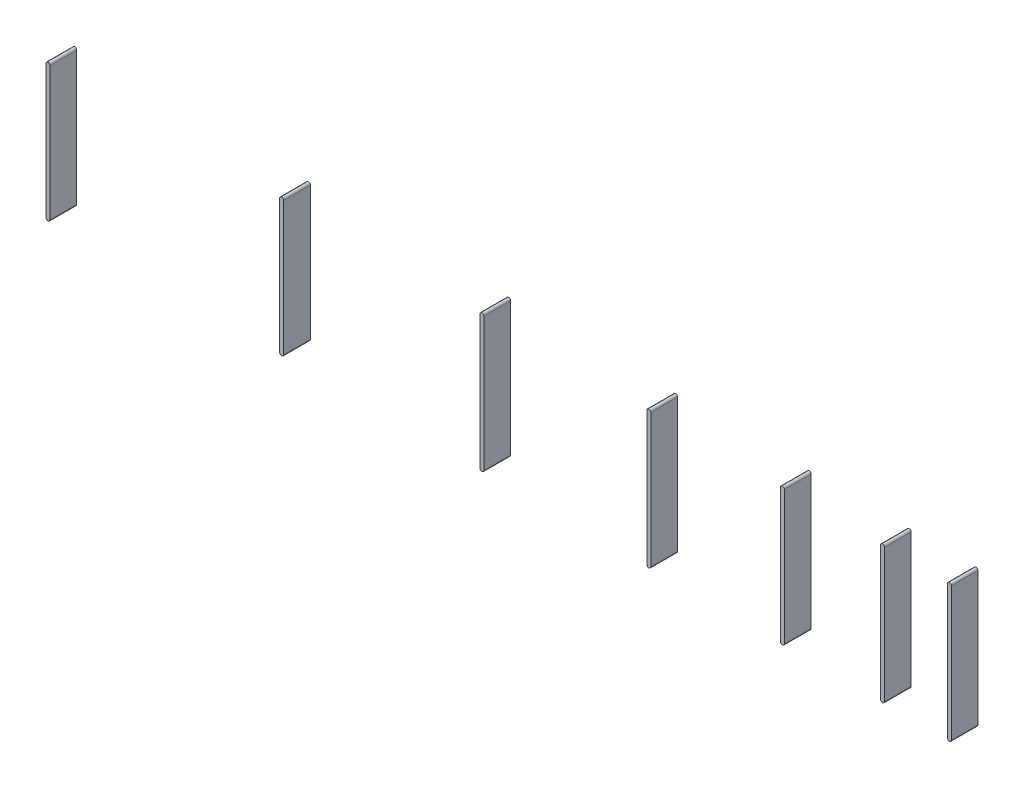
ISO-10303-21;
HEADER;
FILE_DESCRIPTION(('STEP AP214'),'2;1');
FILE_NAME('part.step','',(''),(''),'','','');
FILE_SCHEMA(('AUTOMOTIVE_DESIGN { 1 0 10303 214 1 1 1 1 }'));
ENDSEC;
DATA;
#1=APPLICATION_CONTEXT('core data for automotive mechanical design processes');
#2=APPLICATION_PROTOCOL_DEFINITION('international standard','automotive_design',2000,#1);
#3=PRODUCT_CONTEXT('',#1,'mechanical');
#4=PRODUCT('Part','Part','',(#3));
#5=PRODUCT_RELATED_PRODUCT_CATEGORY('part','',(#4));
#6=PRODUCT_DEFINITION_FORMATION('','',#4);
#7=PRODUCT_DEFINITION_CONTEXT('part definition',#1,'design');
#8=PRODUCT_DEFINITION('design','',#6,#7);
#9=PRODUCT_DEFINITION_SHAPE('','',#8);
#10=(LENGTH_UNIT() NAMED_UNIT(*) SI_UNIT(.MILLI.,.METRE.));
#11=(NAMED_UNIT(*) PLANE_ANGLE_UNIT() SI_UNIT($,.RADIAN.));
#12=(NAMED_UNIT(*) SI_UNIT($,.STERADIAN.) SOLID_ANGLE_UNIT());
#13=UNCERTAINTY_MEASURE_WITH_UNIT(LENGTH_MEASURE(1.E-05),#10,'distance_accuracy_value','');
#14=(GEOMETRIC_REPRESENTATION_CONTEXT(3) GLOBAL_UNCERTAINTY_ASSIGNED_CONTEXT((#13)) GLOBAL_UNIT_ASSIGNED_CONTEXT((#10,
#11,#12)) REPRESENTATION_CONTEXT('',''));
#15=CARTESIAN_POINT('',(0.,0.,0.));
#16=DIRECTION('',(0.,0.,1.));
#17=DIRECTION('',(1.,0.,0.));
#18=AXIS2_PLACEMENT_3D('',#15,#16,#17);
#19=CARTESIAN_POINT('',(-110.,0.,4.));
#20=DIRECTION('',(0.,0.,-1.));
#21=DIRECTION('',(-1.,0.,0.));
#22=AXIS2_PLACEMENT_3D('',#19,#20,#21);
#23=CYLINDRICAL_SURFACE('',#22,0.300000000000009);
#24=CARTESIAN_POINT('',(-110.,0.,0.));
#25=DIRECTION('',(0.,0.,1.));
#26=DIRECTION('',(1.,0.,0.));
#27=AXIS2_PLACEMENT_3D('',#24,#25,#26);
#28=CIRCLE('',#27,0.300000000000009);
#29=CARTESIAN_POINT('',(-109.7,0.,0.));
#30=VERTEX_POINT('',#29);
#31=CARTESIAN_POINT('',(-110.3,0.,0.));
#32=VERTEX_POINT('',#31);
#33=EDGE_CURVE('E107',#30,#32,#28,.T.);
#34=ORIENTED_EDGE('',*,*,#33,.T.);
#35=DIRECTION('',(0.,0.,-1.));
#36=VECTOR('',#35,1.);
#37=CARTESIAN_POINT('',(-110.3,0.,4.));
#38=LINE('',#37,#36);
#39=CARTESIAN_POINT('',(-110.3,0.,4.));
#40=VERTEX_POINT('',#39);
#41=EDGE_CURVE('E12',#40,#32,#38,.T.);
#42=ORIENTED_EDGE('',*,*,#41,.F.);
#43=CARTESIAN_POINT('',(-110.,0.,4.));
#44=DIRECTION('',(0.,0.,1.));
#45=DIRECTION('',(1.,0.,0.));
#46=AXIS2_PLACEMENT_3D('',#43,#44,#45);
#47=CIRCLE('',#46,0.300000000000009);
#48=CARTESIAN_POINT('',(-109.7,0.,4.));
#49=VERTEX_POINT('',#48);
#50=EDGE_CURVE('E95',#49,#40,#47,.T.);
#51=ORIENTED_EDGE('',*,*,#50,.F.);
#52=DIRECTION('',(0.,0.,-1.));
#53=VECTOR('',#52,1.);
#54=CARTESIAN_POINT('',(-109.7,0.,4.));
#55=LINE('',#54,#53);
#56=EDGE_CURVE('E103',#49,#30,#55,.T.);
#57=ORIENTED_EDGE('',*,*,#56,.T.);
#58=EDGE_LOOP('',(#34,#42,#51,#57));
#59=FACE_BOUND('',#58,.T.);
#60=ADVANCED_FACE('F44',(#59),#23,.T.);
#61=CARTESIAN_POINT('',(-110.3,0.,4.));
#62=DIRECTION('',(1.,0.,0.));
#63=DIRECTION('',(0.,0.,-1.));
#64=AXIS2_PLACEMENT_3D('',#61,#62,#63);
#65=PLANE('',#64);
#66=DIRECTION('',(0.,-1.,0.));
#67=VECTOR('',#66,1.);
#68=CARTESIAN_POINT('',(-110.3,0.,0.));
#69=LINE('',#68,#67);
#70=CARTESIAN_POINT('',(-110.3,-20.,0.));
#71=VERTEX_POINT('',#70);
#72=EDGE_CURVE('E99',#32,#71,#69,.T.);
#73=ORIENTED_EDGE('',*,*,#72,.T.);
#74=DIRECTION('',(0.,0.,-1.));
#75=VECTOR('',#74,1.);
#76=CARTESIAN_POINT('',(-110.3,-20.,4.));
#77=LINE('',#76,#75);
#78=CARTESIAN_POINT('',(-110.3,-20.,4.));
#79=VERTEX_POINT('',#78);
#80=EDGE_CURVE('E52',#79,#71,#77,.T.);
#81=ORIENTED_EDGE('',*,*,#80,.F.);
#82=DIRECTION('',(0.,-1.,0.));
#83=VECTOR('',#82,1.);
#84=CARTESIAN_POINT('',(-110.3,0.,4.));
#85=LINE('',#84,#83);
#86=EDGE_CURVE('E90',#40,#79,#85,.T.);
#87=ORIENTED_EDGE('',*,*,#86,.F.);
#88=ORIENTED_EDGE('',*,*,#41,.T.);
#89=EDGE_LOOP('',(#73,#81,#87,#88));
#90=FACE_BOUND('',#89,.T.);
#91=ADVANCED_FACE('F98',(#90),#65,.F.);
#92=CARTESIAN_POINT('',(-110.,-20.,4.));
#93=DIRECTION('',(0.,0.,-1.));
#94=DIRECTION('',(-1.,0.,0.));
#95=AXIS2_PLACEMENT_3D('',#92,#93,#94);
#96=CYLINDRICAL_SURFACE('',#95,0.300000000000009);
#97=CARTESIAN_POINT('',(-110.,-20.,0.));
#98=DIRECTION('',(0.,0.,1.));
#99=DIRECTION('',(1.,0.,0.));
#100=AXIS2_PLACEMENT_3D('',#97,#98,#99);
#101=CIRCLE('',#100,0.300000000000009);
#102=CARTESIAN_POINT('',(-109.7,-20.,0.));
#103=VERTEX_POINT('',#102);
#104=EDGE_CURVE('E77',#71,#103,#101,.T.);
#105=ORIENTED_EDGE('',*,*,#104,.T.);
#106=DIRECTION('',(0.,0.,-1.));
#107=VECTOR('',#106,1.);
#108=CARTESIAN_POINT('',(-109.7,-20.,4.));
#109=LINE('',#108,#107);
#110=CARTESIAN_POINT('',(-109.7,-20.,4.));
#111=VERTEX_POINT('',#110);
#112=EDGE_CURVE('E100',#111,#103,#109,.T.);
#113=ORIENTED_EDGE('',*,*,#112,.F.);
#114=CARTESIAN_POINT('',(-110.,-20.,4.));
#115=DIRECTION('',(0.,0.,1.));
#116=DIRECTION('',(1.,0.,0.));
#117=AXIS2_PLACEMENT_3D('',#114,#115,#116);
#118=CIRCLE('',#117,0.300000000000009);
#119=EDGE_CURVE('E93',#79,#111,#118,.T.);
#120=ORIENTED_EDGE('',*,*,#119,.F.);
#121=ORIENTED_EDGE('',*,*,#80,.T.);
#122=EDGE_LOOP('',(#105,#113,#120,#121));
#123=FACE_BOUND('',#122,.T.);
#124=ADVANCED_FACE('F101',(#123),#96,.T.);
#125=CARTESIAN_POINT('',(-109.7,0.,4.));
#126=DIRECTION('',(-1.,0.,0.));
#127=DIRECTION('',(0.,0.,1.));
#128=AXIS2_PLACEMENT_3D('',#125,#126,#127);
#129=PLANE('',#128);
#130=DIRECTION('',(0.,1.,0.));
#131=VECTOR('',#130,1.);
#132=CARTESIAN_POINT('',(-109.7,0.,0.));
#133=LINE('',#132,#131);
#134=EDGE_CURVE('E83',#103,#30,#133,.T.);
#135=ORIENTED_EDGE('',*,*,#134,.T.);
#136=ORIENTED_EDGE('',*,*,#56,.F.);
#137=DIRECTION('',(0.,1.,0.));
#138=VECTOR('',#137,1.);
#139=CARTESIAN_POINT('',(-109.7,0.,4.));
#140=LINE('',#139,#138);
#141=EDGE_CURVE('E60',#111,#49,#140,.T.);
#142=ORIENTED_EDGE('',*,*,#141,.F.);
#143=ORIENTED_EDGE('',*,*,#112,.T.);
#144=EDGE_LOOP('',(#135,#136,#142,#143));
#145=FACE_BOUND('',#144,.T.);
#146=ADVANCED_FACE('F114',(#145),#129,.F.);
#147=CARTESIAN_POINT('',(-110.,0.,4.));
#148=DIRECTION('',(0.,0.,1.));
#149=DIRECTION('',(1.,0.,0.));
#150=AXIS2_PLACEMENT_3D('',#147,#148,#149);
#151=PLANE('',#150);
#152=ORIENTED_EDGE('',*,*,#50,.T.);
#153=ORIENTED_EDGE('',*,*,#86,.T.);
#154=ORIENTED_EDGE('',*,*,#119,.T.);
#155=ORIENTED_EDGE('',*,*,#141,.T.);
#156=EDGE_LOOP('',(#152,#153,#154,#155));
#157=FACE_BOUND('',#156,.T.);
#158=ADVANCED_FACE('F91',(#157),#151,.T.);
#159=CARTESIAN_POINT('',(-110.,0.,0.));
#160=DIRECTION('',(0.,0.,1.));
#161=DIRECTION('',(1.,0.,0.));
#162=AXIS2_PLACEMENT_3D('',#159,#160,#161);
#163=PLANE('',#162);
#164=ORIENTED_EDGE('',*,*,#33,.F.);
#165=ORIENTED_EDGE('',*,*,#134,.F.);
#166=ORIENTED_EDGE('',*,*,#104,.F.);
#167=ORIENTED_EDGE('',*,*,#72,.F.);
#168=EDGE_LOOP('',(#164,#165,#166,#167));
#169=FACE_BOUND('',#168,.T.);
#170=ADVANCED_FACE('F117',(#169),#163,.F.);
#171=CLOSED_SHELL('',(#60,#91,#124,#146,#158,#170));
#172=MANIFOLD_SOLID_BREP('B2',#171);
#173=CARTESIAN_POINT('',(-75.,0.,4.));
#174=DIRECTION('',(0.,0.,-1.));
#175=DIRECTION('',(-1.,0.,0.));
#176=AXIS2_PLACEMENT_3D('',#173,#174,#175);
#177=CYLINDRICAL_SURFACE('',#176,0.300000000000009);
#178=CARTESIAN_POINT('',(-75.,0.,0.));
#179=DIRECTION('',(0.,0.,1.));
#180=DIRECTION('',(1.,0.,0.));
#181=AXIS2_PLACEMENT_3D('',#178,#179,#180);
#182=CIRCLE('',#181,0.300000000000009);
#183=CARTESIAN_POINT('',(-74.7,0.,0.));
#184=VERTEX_POINT('',#183);
#185=CARTESIAN_POINT('',(-75.3,0.,0.));
#186=VERTEX_POINT('',#185);
#187=EDGE_CURVE('E241',#184,#186,#182,.T.);
#188=ORIENTED_EDGE('',*,*,#187,.T.);
#189=DIRECTION('',(0.,0.,-1.));
#190=VECTOR('',#189,1.);
#191=CARTESIAN_POINT('',(-75.3,0.,4.));
#192=LINE('',#191,#190);
#193=CARTESIAN_POINT('',(-75.3,0.,4.));
#194=VERTEX_POINT('',#193);
#195=EDGE_CURVE('E42',#194,#186,#192,.T.);
#196=ORIENTED_EDGE('',*,*,#195,.F.);
#197=CARTESIAN_POINT('',(-75.,0.,4.));
#198=DIRECTION('',(0.,0.,1.));
#199=DIRECTION('',(1.,0.,0.));
#200=AXIS2_PLACEMENT_3D('',#197,#198,#199);
#201=CIRCLE('',#200,0.300000000000009);
#202=CARTESIAN_POINT('',(-74.7,0.,4.));
#203=VERTEX_POINT('',#202);
#204=EDGE_CURVE('E229',#203,#194,#201,.T.);
#205=ORIENTED_EDGE('',*,*,#204,.F.);
#206=DIRECTION('',(0.,0.,-1.));
#207=VECTOR('',#206,1.);
#208=CARTESIAN_POINT('',(-74.7,0.,4.));
#209=LINE('',#208,#207);
#210=EDGE_CURVE('E237',#203,#184,#209,.T.);
#211=ORIENTED_EDGE('',*,*,#210,.T.);
#212=EDGE_LOOP('',(#188,#196,#205,#211));
#213=FACE_BOUND('',#212,.T.);
#214=ADVANCED_FACE('F178',(#213),#177,.T.);
#215=CARTESIAN_POINT('',(-75.3,0.,4.));
#216=DIRECTION('',(1.,0.,0.));
#217=DIRECTION('',(0.,0.,-1.));
#218=AXIS2_PLACEMENT_3D('',#215,#216,#217);
#219=PLANE('',#218);
#220=DIRECTION('',(0.,-1.,0.));
#221=VECTOR('',#220,1.);
#222=CARTESIAN_POINT('',(-75.3,0.,0.));
#223=LINE('',#222,#221);
#224=CARTESIAN_POINT('',(-75.3,-20.,0.));
#225=VERTEX_POINT('',#224);
#226=EDGE_CURVE('E233',#186,#225,#223,.T.);
#227=ORIENTED_EDGE('',*,*,#226,.T.);
#228=DIRECTION('',(0.,0.,-1.));
#229=VECTOR('',#228,1.);
#230=CARTESIAN_POINT('',(-75.3,-20.,4.));
#231=LINE('',#230,#229);
#232=CARTESIAN_POINT('',(-75.3,-20.,4.));
#233=VERTEX_POINT('',#232);
#234=EDGE_CURVE('E186',#233,#225,#231,.T.);
#235=ORIENTED_EDGE('',*,*,#234,.F.);
#236=DIRECTION('',(0.,-1.,0.));
#237=VECTOR('',#236,1.);
#238=CARTESIAN_POINT('',(-75.3,0.,4.));
#239=LINE('',#238,#237);
#240=EDGE_CURVE('E224',#194,#233,#239,.T.);
#241=ORIENTED_EDGE('',*,*,#240,.F.);
#242=ORIENTED_EDGE('',*,*,#195,.T.);
#243=EDGE_LOOP('',(#227,#235,#241,#242));
#244=FACE_BOUND('',#243,.T.);
#245=ADVANCED_FACE('F232',(#244),#219,.F.);
#246=CARTESIAN_POINT('',(-75.,-20.,4.));
#247=DIRECTION('',(0.,0.,-1.));
#248=DIRECTION('',(-1.,0.,0.));
#249=AXIS2_PLACEMENT_3D('',#246,#247,#248);
#250=CYLINDRICAL_SURFACE('',#249,0.300000000000009);
#251=CARTESIAN_POINT('',(-75.,-20.,0.));
#252=DIRECTION('',(0.,0.,1.));
#253=DIRECTION('',(1.,0.,0.));
#254=AXIS2_PLACEMENT_3D('',#251,#252,#253);
#255=CIRCLE('',#254,0.300000000000009);
#256=CARTESIAN_POINT('',(-74.7,-20.,0.));
#257=VERTEX_POINT('',#256);
#258=EDGE_CURVE('E211',#225,#257,#255,.T.);
#259=ORIENTED_EDGE('',*,*,#258,.T.);
#260=DIRECTION('',(0.,0.,-1.));
#261=VECTOR('',#260,1.);
#262=CARTESIAN_POINT('',(-74.7,-20.,4.));
#263=LINE('',#262,#261);
#264=CARTESIAN_POINT('',(-74.7,-20.,4.));
#265=VERTEX_POINT('',#264);
#266=EDGE_CURVE('E234',#265,#257,#263,.T.);
#267=ORIENTED_EDGE('',*,*,#266,.F.);
#268=CARTESIAN_POINT('',(-75.,-20.,4.));
#269=DIRECTION('',(0.,0.,1.));
#270=DIRECTION('',(1.,0.,0.));
#271=AXIS2_PLACEMENT_3D('',#268,#269,#270);
#272=CIRCLE('',#271,0.300000000000009);
#273=EDGE_CURVE('E227',#233,#265,#272,.T.);
#274=ORIENTED_EDGE('',*,*,#273,.F.);
#275=ORIENTED_EDGE('',*,*,#234,.T.);
#276=EDGE_LOOP('',(#259,#267,#274,#275));
#277=FACE_BOUND('',#276,.T.);
#278=ADVANCED_FACE('F235',(#277),#250,.T.);
#279=CARTESIAN_POINT('',(-74.7,0.,4.));
#280=DIRECTION('',(-1.,0.,0.));
#281=DIRECTION('',(0.,0.,1.));
#282=AXIS2_PLACEMENT_3D('',#279,#280,#281);
#283=PLANE('',#282);
#284=DIRECTION('',(0.,1.,0.));
#285=VECTOR('',#284,1.);
#286=CARTESIAN_POINT('',(-74.7,0.,0.));
#287=LINE('',#286,#285);
#288=EDGE_CURVE('E217',#257,#184,#287,.T.);
#289=ORIENTED_EDGE('',*,*,#288,.T.);
#290=ORIENTED_EDGE('',*,*,#210,.F.);
#291=DIRECTION('',(0.,1.,0.));
#292=VECTOR('',#291,1.);
#293=CARTESIAN_POINT('',(-74.7,0.,4.));
#294=LINE('',#293,#292);
#295=EDGE_CURVE('E194',#265,#203,#294,.T.);
#296=ORIENTED_EDGE('',*,*,#295,.F.);
#297=ORIENTED_EDGE('',*,*,#266,.T.);
#298=EDGE_LOOP('',(#289,#290,#296,#297));
#299=FACE_BOUND('',#298,.T.);
#300=ADVANCED_FACE('F248',(#299),#283,.F.);
#301=CARTESIAN_POINT('',(-75.,0.,4.));
#302=DIRECTION('',(0.,0.,1.));
#303=DIRECTION('',(1.,0.,0.));
#304=AXIS2_PLACEMENT_3D('',#301,#302,#303);
#305=PLANE('',#304);
#306=ORIENTED_EDGE('',*,*,#204,.T.);
#307=ORIENTED_EDGE('',*,*,#240,.T.);
#308=ORIENTED_EDGE('',*,*,#273,.T.);
#309=ORIENTED_EDGE('',*,*,#295,.T.);
#310=EDGE_LOOP('',(#306,#307,#308,#309));
#311=FACE_BOUND('',#310,.T.);
#312=ADVANCED_FACE('F225',(#311),#305,.T.);
#313=CARTESIAN_POINT('',(-75.,0.,0.));
#314=DIRECTION('',(0.,0.,1.));
#315=DIRECTION('',(1.,0.,0.));
#316=AXIS2_PLACEMENT_3D('',#313,#314,#315);
#317=PLANE('',#316);
#318=ORIENTED_EDGE('',*,*,#187,.F.);
#319=ORIENTED_EDGE('',*,*,#288,.F.);
#320=ORIENTED_EDGE('',*,*,#258,.F.);
#321=ORIENTED_EDGE('',*,*,#226,.F.);
#322=EDGE_LOOP('',(#318,#319,#320,#321));
#323=FACE_BOUND('',#322,.T.);
#324=ADVANCED_FACE('F251',(#323),#317,.F.);
#325=CLOSED_SHELL('',(#214,#245,#278,#300,#312,#324));
#326=MANIFOLD_SOLID_BREP('B6',#325);
#327=CARTESIAN_POINT('',(-45.,0.,4.));
#328=DIRECTION('',(0.,0.,-1.));
#329=DIRECTION('',(-1.,0.,0.));
#330=AXIS2_PLACEMENT_3D('',#327,#328,#329);
#331=CYLINDRICAL_SURFACE('',#330,0.300000000000009);
#332=CARTESIAN_POINT('',(-45.,0.,0.));
#333=DIRECTION('',(0.,0.,1.));
#334=DIRECTION('',(1.,0.,0.));
#335=AXIS2_PLACEMENT_3D('',#332,#333,#334);
#336=CIRCLE('',#335,0.300000000000009);
#337=CARTESIAN_POINT('',(-44.7,0.,0.));
#338=VERTEX_POINT('',#337);
#339=CARTESIAN_POINT('',(-45.3,0.,0.));
#340=VERTEX_POINT('',#339);
#341=EDGE_CURVE('E375',#338,#340,#336,.T.);
#342=ORIENTED_EDGE('',*,*,#341,.T.);
#343=DIRECTION('',(0.,0.,-1.));
#344=VECTOR('',#343,1.);
#345=CARTESIAN_POINT('',(-45.3,0.,4.));
#346=LINE('',#345,#344);
#347=CARTESIAN_POINT('',(-45.3,0.,4.));
#348=VERTEX_POINT('',#347);
#349=EDGE_CURVE('E176',#348,#340,#346,.T.);
#350=ORIENTED_EDGE('',*,*,#349,.F.);
#351=CARTESIAN_POINT('',(-45.,0.,4.));
#352=DIRECTION('',(0.,0.,1.));
#353=DIRECTION('',(1.,0.,0.));
#354=AXIS2_PLACEMENT_3D('',#351,#352,#353);
#355=CIRCLE('',#354,0.300000000000009);
#356=CARTESIAN_POINT('',(-44.7,0.,4.));
#357=VERTEX_POINT('',#356);
#358=EDGE_CURVE('E363',#357,#348,#355,.T.);
#359=ORIENTED_EDGE('',*,*,#358,.F.);
#360=DIRECTION('',(0.,0.,-1.));
#361=VECTOR('',#360,1.);
#362=CARTESIAN_POINT('',(-44.7,0.,4.));
#363=LINE('',#362,#361);
#364=EDGE_CURVE('E371',#357,#338,#363,.T.);
#365=ORIENTED_EDGE('',*,*,#364,.T.);
#366=EDGE_LOOP('',(#342,#350,#359,#365));
#367=FACE_BOUND('',#366,.T.);
#368=ADVANCED_FACE('F312',(#367),#331,.T.);
#369=CARTESIAN_POINT('',(-45.3,0.,4.));
#370=DIRECTION('',(1.,0.,0.));
#371=DIRECTION('',(0.,1.,0.));
#372=AXIS2_PLACEMENT_3D('',#369,#370,#371);
#373=PLANE('',#372);
#374=DIRECTION('',(0.,-1.,0.));
#375=VECTOR('',#374,1.);
#376=CARTESIAN_POINT('',(-45.3,0.,0.));
#377=LINE('',#376,#375);
#378=CARTESIAN_POINT('',(-45.3,-20.,0.));
#379=VERTEX_POINT('',#378);
#380=EDGE_CURVE('E367',#340,#379,#377,.T.);
#381=ORIENTED_EDGE('',*,*,#380,.T.);
#382=DIRECTION('',(0.,0.,-1.));
#383=VECTOR('',#382,1.);
#384=CARTESIAN_POINT('',(-45.3,-20.,4.));
#385=LINE('',#384,#383);
#386=CARTESIAN_POINT('',(-45.3,-20.,4.));
#387=VERTEX_POINT('',#386);
#388=EDGE_CURVE('E320',#387,#379,#385,.T.);
#389=ORIENTED_EDGE('',*,*,#388,.F.);
#390=DIRECTION('',(0.,-1.,0.));
#391=VECTOR('',#390,1.);
#392=CARTESIAN_POINT('',(-45.3,0.,4.));
#393=LINE('',#392,#391);
#394=EDGE_CURVE('E358',#348,#387,#393,.T.);
#395=ORIENTED_EDGE('',*,*,#394,.F.);
#396=ORIENTED_EDGE('',*,*,#349,.T.);
#397=EDGE_LOOP('',(#381,#389,#395,#396));
#398=FACE_BOUND('',#397,.T.);
#399=ADVANCED_FACE('F366',(#398),#373,.F.);
#400=CARTESIAN_POINT('',(-45.,-20.,4.));
#401=DIRECTION('',(0.,0.,-1.));
#402=DIRECTION('',(-1.,0.,0.));
#403=AXIS2_PLACEMENT_3D('',#400,#401,#402);
#404=CYLINDRICAL_SURFACE('',#403,0.299999999999998);
#405=CARTESIAN_POINT('',(-45.,-20.,0.));
#406=DIRECTION('',(0.,0.,1.));
#407=DIRECTION('',(1.,0.,0.));
#408=AXIS2_PLACEMENT_3D('',#405,#406,#407);
#409=CIRCLE('',#408,0.299999999999998);
#410=CARTESIAN_POINT('',(-44.7,-20.,0.));
#411=VERTEX_POINT('',#410);
#412=EDGE_CURVE('E345',#379,#411,#409,.T.);
#413=ORIENTED_EDGE('',*,*,#412,.T.);
#414=DIRECTION('',(0.,0.,-1.));
#415=VECTOR('',#414,1.);
#416=CARTESIAN_POINT('',(-44.7,-20.,4.));
#417=LINE('',#416,#415);
#418=CARTESIAN_POINT('',(-44.7,-20.,4.));
#419=VERTEX_POINT('',#418);
#420=EDGE_CURVE('E368',#419,#411,#417,.T.);
#421=ORIENTED_EDGE('',*,*,#420,.F.);
#422=CARTESIAN_POINT('',(-45.,-20.,4.));
#423=DIRECTION('',(0.,0.,1.));
#424=DIRECTION('',(1.,0.,0.));
#425=AXIS2_PLACEMENT_3D('',#422,#423,#424);
#426=CIRCLE('',#425,0.299999999999998);
#427=EDGE_CURVE('E361',#387,#419,#426,.T.);
#428=ORIENTED_EDGE('',*,*,#427,.F.);
#429=ORIENTED_EDGE('',*,*,#388,.T.);
#430=EDGE_LOOP('',(#413,#421,#428,#429));
#431=FACE_BOUND('',#430,.T.);
#432=ADVANCED_FACE('F369',(#431),#404,.T.);
#433=CARTESIAN_POINT('',(-44.7,0.,4.));
#434=DIRECTION('',(-1.,0.,0.));
#435=DIRECTION('',(0.,-1.,0.));
#436=AXIS2_PLACEMENT_3D('',#433,#434,#435);
#437=PLANE('',#436);
#438=DIRECTION('',(0.,1.,0.));
#439=VECTOR('',#438,1.);
#440=CARTESIAN_POINT('',(-44.7,0.,0.));
#441=LINE('',#440,#439);
#442=EDGE_CURVE('E351',#411,#338,#441,.T.);
#443=ORIENTED_EDGE('',*,*,#442,.T.);
#444=ORIENTED_EDGE('',*,*,#364,.F.);
#445=DIRECTION('',(0.,1.,0.));
#446=VECTOR('',#445,1.);
#447=CARTESIAN_POINT('',(-44.7,0.,4.));
#448=LINE('',#447,#446);
#449=EDGE_CURVE('E328',#419,#357,#448,.T.);
#450=ORIENTED_EDGE('',*,*,#449,.F.);
#451=ORIENTED_EDGE('',*,*,#420,.T.);
#452=EDGE_LOOP('',(#443,#444,#450,#451));
#453=FACE_BOUND('',#452,.T.);
#454=ADVANCED_FACE('F382',(#453),#437,.F.);
#455=CARTESIAN_POINT('',(-45.,0.,4.));
#456=DIRECTION('',(0.,0.,1.));
#457=DIRECTION('',(1.,0.,0.));
#458=AXIS2_PLACEMENT_3D('',#455,#456,#457);
#459=PLANE('',#458);
#460=ORIENTED_EDGE('',*,*,#358,.T.);
#461=ORIENTED_EDGE('',*,*,#394,.T.);
#462=ORIENTED_EDGE('',*,*,#427,.T.);
#463=ORIENTED_EDGE('',*,*,#449,.T.);
#464=EDGE_LOOP('',(#460,#461,#462,#463));
#465=FACE_BOUND('',#464,.T.);
#466=ADVANCED_FACE('F359',(#465),#459,.T.);
#467=CARTESIAN_POINT('',(-45.,0.,0.));
#468=DIRECTION('',(0.,0.,1.));
#469=DIRECTION('',(1.,0.,0.));
#470=AXIS2_PLACEMENT_3D('',#467,#468,#469);
#471=PLANE('',#470);
#472=ORIENTED_EDGE('',*,*,#341,.F.);
#473=ORIENTED_EDGE('',*,*,#442,.F.);
#474=ORIENTED_EDGE('',*,*,#412,.F.);
#475=ORIENTED_EDGE('',*,*,#380,.F.);
#476=EDGE_LOOP('',(#472,#473,#474,#475));
#477=FACE_BOUND('',#476,.T.);
#478=ADVANCED_FACE('F385',(#477),#471,.F.);
#479=CLOSED_SHELL('',(#368,#399,#432,#454,#466,#478));
#480=MANIFOLD_SOLID_BREP('B36',#479);
#481=CARTESIAN_POINT('',(-20.,0.,4.));
#482=DIRECTION('',(0.,0.,-1.));
#483=DIRECTION('',(-1.,0.,0.));
#484=AXIS2_PLACEMENT_3D('',#481,#482,#483);
#485=CYLINDRICAL_SURFACE('',#484,0.300000000000002);
#486=CARTESIAN_POINT('',(-20.,0.,0.));
#487=DIRECTION('',(0.,0.,1.));
#488=DIRECTION('',(1.,0.,0.));
#489=AXIS2_PLACEMENT_3D('',#486,#487,#488);
#490=CIRCLE('',#489,0.300000000000002);
#491=CARTESIAN_POINT('',(-19.7,0.,0.));
#492=VERTEX_POINT('',#491);
#493=CARTESIAN_POINT('',(-20.3,0.,0.));
#494=VERTEX_POINT('',#493);
#495=EDGE_CURVE('E509',#492,#494,#490,.T.);
#496=ORIENTED_EDGE('',*,*,#495,.T.);
#497=DIRECTION('',(0.,0.,-1.));
#498=VECTOR('',#497,1.);
#499=CARTESIAN_POINT('',(-20.3,0.,4.));
#500=LINE('',#499,#498);
#501=CARTESIAN_POINT('',(-20.3,0.,4.));
#502=VERTEX_POINT('',#501);
#503=EDGE_CURVE('E310',#502,#494,#500,.T.);
#504=ORIENTED_EDGE('',*,*,#503,.F.);
#505=CARTESIAN_POINT('',(-20.,0.,4.));
#506=DIRECTION('',(0.,0.,1.));
#507=DIRECTION('',(1.,0.,0.));
#508=AXIS2_PLACEMENT_3D('',#505,#506,#507);
#509=CIRCLE('',#508,0.300000000000002);
#510=CARTESIAN_POINT('',(-19.7,0.,4.));
#511=VERTEX_POINT('',#510);
#512=EDGE_CURVE('E497',#511,#502,#509,.T.);
#513=ORIENTED_EDGE('',*,*,#512,.F.);
#514=DIRECTION('',(0.,0.,-1.));
#515=VECTOR('',#514,1.);
#516=CARTESIAN_POINT('',(-19.7,0.,4.));
#517=LINE('',#516,#515);
#518=EDGE_CURVE('E505',#511,#492,#517,.T.);
#519=ORIENTED_EDGE('',*,*,#518,.T.);
#520=EDGE_LOOP('',(#496,#504,#513,#519));
#521=FACE_BOUND('',#520,.T.);
#522=ADVANCED_FACE('F446',(#521),#485,.T.);
#523=CARTESIAN_POINT('',(-20.3,0.,4.));
#524=DIRECTION('',(1.,0.,0.));
#525=DIRECTION('',(0.,1.,0.));
#526=AXIS2_PLACEMENT_3D('',#523,#524,#525);
#527=PLANE('',#526);
#528=DIRECTION('',(0.,-1.,0.));
#529=VECTOR('',#528,1.);
#530=CARTESIAN_POINT('',(-20.3,0.,0.));
#531=LINE('',#530,#529);
#532=CARTESIAN_POINT('',(-20.3,-20.,0.));
#533=VERTEX_POINT('',#532);
#534=EDGE_CURVE('E501',#494,#533,#531,.T.);
#535=ORIENTED_EDGE('',*,*,#534,.T.);
#536=DIRECTION('',(0.,0.,-1.));
#537=VECTOR('',#536,1.);
#538=CARTESIAN_POINT('',(-20.3,-20.,4.));
#539=LINE('',#538,#537);
#540=CARTESIAN_POINT('',(-20.3,-20.,4.));
#541=VERTEX_POINT('',#540);
#542=EDGE_CURVE('E454',#541,#533,#539,.T.);
#543=ORIENTED_EDGE('',*,*,#542,.F.);
#544=DIRECTION('',(0.,-1.,0.));
#545=VECTOR('',#544,1.);
#546=CARTESIAN_POINT('',(-20.3,0.,4.));
#547=LINE('',#546,#545);
#548=EDGE_CURVE('E492',#502,#541,#547,.T.);
#549=ORIENTED_EDGE('',*,*,#548,.F.);
#550=ORIENTED_EDGE('',*,*,#503,.T.);
#551=EDGE_LOOP('',(#535,#543,#549,#550));
#552=FACE_BOUND('',#551,.T.);
#553=ADVANCED_FACE('F500',(#552),#527,.F.);
#554=CARTESIAN_POINT('',(-20.,-20.,4.));
#555=DIRECTION('',(0.,0.,-1.));
#556=DIRECTION('',(-1.,0.,0.));
#557=AXIS2_PLACEMENT_3D('',#554,#555,#556);
#558=CYLINDRICAL_SURFACE('',#557,0.3);
#559=CARTESIAN_POINT('',(-20.,-20.,0.));
#560=DIRECTION('',(0.,0.,1.));
#561=DIRECTION('',(1.,0.,0.));
#562=AXIS2_PLACEMENT_3D('',#559,#560,#561);
#563=CIRCLE('',#562,0.3);
#564=CARTESIAN_POINT('',(-19.7,-20.,0.));
#565=VERTEX_POINT('',#564);
#566=EDGE_CURVE('E479',#533,#565,#563,.T.);
#567=ORIENTED_EDGE('',*,*,#566,.T.);
#568=DIRECTION('',(0.,0.,-1.));
#569=VECTOR('',#568,1.);
#570=CARTESIAN_POINT('',(-19.7,-20.,4.));
#571=LINE('',#570,#569);
#572=CARTESIAN_POINT('',(-19.7,-20.,4.));
#573=VERTEX_POINT('',#572);
#574=EDGE_CURVE('E502',#573,#565,#571,.T.);
#575=ORIENTED_EDGE('',*,*,#574,.F.);
#576=CARTESIAN_POINT('',(-20.,-20.,4.));
#577=DIRECTION('',(0.,0.,1.));
#578=DIRECTION('',(1.,0.,0.));
#579=AXIS2_PLACEMENT_3D('',#576,#577,#578);
#580=CIRCLE('',#579,0.3);
#581=EDGE_CURVE('E495',#541,#573,#580,.T.);
#582=ORIENTED_EDGE('',*,*,#581,.F.);
#583=ORIENTED_EDGE('',*,*,#542,.T.);
#584=EDGE_LOOP('',(#567,#575,#582,#583));
#585=FACE_BOUND('',#584,.T.);
#586=ADVANCED_FACE('F503',(#585),#558,.T.);
#587=CARTESIAN_POINT('',(-19.7,0.,4.));
#588=DIRECTION('',(-1.,0.,0.));
#589=DIRECTION('',(0.,0.,1.));
#590=AXIS2_PLACEMENT_3D('',#587,#588,#589);
#591=PLANE('',#590);
#592=DIRECTION('',(0.,1.,0.));
#593=VECTOR('',#592,1.);
#594=CARTESIAN_POINT('',(-19.7,0.,0.));
#595=LINE('',#594,#593);
#596=EDGE_CURVE('E485',#565,#492,#595,.T.);
#597=ORIENTED_EDGE('',*,*,#596,.T.);
#598=ORIENTED_EDGE('',*,*,#518,.F.);
#599=DIRECTION('',(0.,1.,0.));
#600=VECTOR('',#599,1.);
#601=CARTESIAN_POINT('',(-19.7,0.,4.));
#602=LINE('',#601,#600);
#603=EDGE_CURVE('E462',#573,#511,#602,.T.);
#604=ORIENTED_EDGE('',*,*,#603,.F.);
#605=ORIENTED_EDGE('',*,*,#574,.T.);
#606=EDGE_LOOP('',(#597,#598,#604,#605));
#607=FACE_BOUND('',#606,.T.);
#608=ADVANCED_FACE('F516',(#607),#591,.F.);
#609=CARTESIAN_POINT('',(-20.,0.,4.));
#610=DIRECTION('',(0.,0.,1.));
#611=DIRECTION('',(1.,0.,0.));
#612=AXIS2_PLACEMENT_3D('',#609,#610,#611);
#613=PLANE('',#612);
#614=ORIENTED_EDGE('',*,*,#512,.T.);
#615=ORIENTED_EDGE('',*,*,#548,.T.);
#616=ORIENTED_EDGE('',*,*,#581,.T.);
#617=ORIENTED_EDGE('',*,*,#603,.T.);
#618=EDGE_LOOP('',(#614,#615,#616,#617));
#619=FACE_BOUND('',#618,.T.);
#620=ADVANCED_FACE('F493',(#619),#613,.T.);
#621=CARTESIAN_POINT('',(-20.,0.,0.));
#622=DIRECTION('',(0.,0.,1.));
#623=DIRECTION('',(1.,0.,0.));
#624=AXIS2_PLACEMENT_3D('',#621,#622,#623);
#625=PLANE('',#624);
#626=ORIENTED_EDGE('',*,*,#495,.F.);
#627=ORIENTED_EDGE('',*,*,#596,.F.);
#628=ORIENTED_EDGE('',*,*,#566,.F.);
#629=ORIENTED_EDGE('',*,*,#534,.F.);
#630=EDGE_LOOP('',(#626,#627,#628,#629));
#631=FACE_BOUND('',#630,.T.);
#632=ADVANCED_FACE('F519',(#631),#625,.F.);
#633=CLOSED_SHELL('',(#522,#553,#586,#608,#620,#632));
#634=MANIFOLD_SOLID_BREP('B170',#633);
#635=CARTESIAN_POINT('',(15.,0.,4.));
#636=DIRECTION('',(0.,0.,-1.));
#637=DIRECTION('',(-1.,0.,0.));
#638=AXIS2_PLACEMENT_3D('',#635,#636,#637);
#639=CYLINDRICAL_SURFACE('',#638,0.3);
#640=CARTESIAN_POINT('',(15.,0.,0.));
#641=DIRECTION('',(0.,0.,1.));
#642=DIRECTION('',(1.,0.,0.));
#643=AXIS2_PLACEMENT_3D('',#640,#641,#642);
#644=CIRCLE('',#643,0.3);
#645=CARTESIAN_POINT('',(15.3,0.,0.));
#646=VERTEX_POINT('',#645);
#647=CARTESIAN_POINT('',(14.7,0.,0.));
#648=VERTEX_POINT('',#647);
#649=EDGE_CURVE('E643',#646,#648,#644,.T.);
#650=ORIENTED_EDGE('',*,*,#649,.T.);
#651=DIRECTION('',(0.,0.,-1.));
#652=VECTOR('',#651,1.);
#653=CARTESIAN_POINT('',(14.7,0.,4.));
#654=LINE('',#653,#652);
#655=CARTESIAN_POINT('',(14.7,0.,4.));
#656=VERTEX_POINT('',#655);
#657=EDGE_CURVE('E444',#656,#648,#654,.T.);
#658=ORIENTED_EDGE('',*,*,#657,.F.);
#659=CARTESIAN_POINT('',(15.,0.,4.));
#660=DIRECTION('',(0.,0.,1.));
#661=DIRECTION('',(1.,0.,0.));
#662=AXIS2_PLACEMENT_3D('',#659,#660,#661);
#663=CIRCLE('',#662,0.3);
#664=CARTESIAN_POINT('',(15.3,0.,4.));
#665=VERTEX_POINT('',#664);
#666=EDGE_CURVE('E631',#665,#656,#663,.T.);
#667=ORIENTED_EDGE('',*,*,#666,.F.);
#668=DIRECTION('',(0.,0.,-1.));
#669=VECTOR('',#668,1.);
#670=CARTESIAN_POINT('',(15.3,0.,4.));
#671=LINE('',#670,#669);
#672=EDGE_CURVE('E639',#665,#646,#671,.T.);
#673=ORIENTED_EDGE('',*,*,#672,.T.);
#674=EDGE_LOOP('',(#650,#658,#667,#673));
#675=FACE_BOUND('',#674,.T.);
#676=ADVANCED_FACE('F580',(#675),#639,.T.);
#677=CARTESIAN_POINT('',(14.7,0.,4.));
#678=DIRECTION('',(1.,0.,0.));
#679=DIRECTION('',(0.,1.,0.));
#680=AXIS2_PLACEMENT_3D('',#677,#678,#679);
#681=PLANE('',#680);
#682=DIRECTION('',(0.,-1.,0.));
#683=VECTOR('',#682,1.);
#684=CARTESIAN_POINT('',(14.7,0.,0.));
#685=LINE('',#684,#683);
#686=CARTESIAN_POINT('',(14.7,-20.,0.));
#687=VERTEX_POINT('',#686);
#688=EDGE_CURVE('E635',#648,#687,#685,.T.);
#689=ORIENTED_EDGE('',*,*,#688,.T.);
#690=DIRECTION('',(0.,0.,-1.));
#691=VECTOR('',#690,1.);
#692=CARTESIAN_POINT('',(14.7,-20.,4.));
#693=LINE('',#692,#691);
#694=CARTESIAN_POINT('',(14.7,-20.,4.));
#695=VERTEX_POINT('',#694);
#696=EDGE_CURVE('E588',#695,#687,#693,.T.);
#697=ORIENTED_EDGE('',*,*,#696,.F.);
#698=DIRECTION('',(0.,-1.,0.));
#699=VECTOR('',#698,1.);
#700=CARTESIAN_POINT('',(14.7,0.,4.));
#701=LINE('',#700,#699);
#702=EDGE_CURVE('E626',#656,#695,#701,.T.);
#703=ORIENTED_EDGE('',*,*,#702,.F.);
#704=ORIENTED_EDGE('',*,*,#657,.T.);
#705=EDGE_LOOP('',(#689,#697,#703,#704));
#706=FACE_BOUND('',#705,.T.);
#707=ADVANCED_FACE('F634',(#706),#681,.F.);
#708=CARTESIAN_POINT('',(15.,-20.,4.));
#709=DIRECTION('',(0.,0.,-1.));
#710=DIRECTION('',(-1.,0.,0.));
#711=AXIS2_PLACEMENT_3D('',#708,#709,#710);
#712=CYLINDRICAL_SURFACE('',#711,0.299999999999999);
#713=CARTESIAN_POINT('',(15.,-20.,0.));
#714=DIRECTION('',(0.,0.,1.));
#715=DIRECTION('',(1.,0.,0.));
#716=AXIS2_PLACEMENT_3D('',#713,#714,#715);
#717=CIRCLE('',#716,0.299999999999999);
#718=CARTESIAN_POINT('',(15.3,-20.,0.));
#719=VERTEX_POINT('',#718);
#720=EDGE_CURVE('E613',#687,#719,#717,.T.);
#721=ORIENTED_EDGE('',*,*,#720,.T.);
#722=DIRECTION('',(0.,0.,-1.));
#723=VECTOR('',#722,1.);
#724=CARTESIAN_POINT('',(15.3,-20.,4.));
#725=LINE('',#724,#723);
#726=CARTESIAN_POINT('',(15.3,-20.,4.));
#727=VERTEX_POINT('',#726);
#728=EDGE_CURVE('E636',#727,#719,#725,.T.);
#729=ORIENTED_EDGE('',*,*,#728,.F.);
#730=CARTESIAN_POINT('',(15.,-20.,4.));
#731=DIRECTION('',(0.,0.,1.));
#732=DIRECTION('',(1.,0.,0.));
#733=AXIS2_PLACEMENT_3D('',#730,#731,#732);
#734=CIRCLE('',#733,0.299999999999999);
#735=EDGE_CURVE('E629',#695,#727,#734,.T.);
#736=ORIENTED_EDGE('',*,*,#735,.F.);
#737=ORIENTED_EDGE('',*,*,#696,.T.);
#738=EDGE_LOOP('',(#721,#729,#736,#737));
#739=FACE_BOUND('',#738,.T.);
#740=ADVANCED_FACE('F637',(#739),#712,.T.);
#741=CARTESIAN_POINT('',(15.3,0.,4.));
#742=DIRECTION('',(-1.,0.,0.));
#743=DIRECTION('',(0.,-1.,0.));
#744=AXIS2_PLACEMENT_3D('',#741,#742,#743);
#745=PLANE('',#744);
#746=DIRECTION('',(0.,1.,0.));
#747=VECTOR('',#746,1.);
#748=CARTESIAN_POINT('',(15.3,0.,0.));
#749=LINE('',#748,#747);
#750=EDGE_CURVE('E619',#719,#646,#749,.T.);
#751=ORIENTED_EDGE('',*,*,#750,.T.);
#752=ORIENTED_EDGE('',*,*,#672,.F.);
#753=DIRECTION('',(0.,1.,0.));
#754=VECTOR('',#753,1.);
#755=CARTESIAN_POINT('',(15.3,0.,4.));
#756=LINE('',#755,#754);
#757=EDGE_CURVE('E596',#727,#665,#756,.T.);
#758=ORIENTED_EDGE('',*,*,#757,.F.);
#759=ORIENTED_EDGE('',*,*,#728,.T.);
#760=EDGE_LOOP('',(#751,#752,#758,#759));
#761=FACE_BOUND('',#760,.T.);
#762=ADVANCED_FACE('F650',(#761),#745,.F.);
#763=CARTESIAN_POINT('',(15.,0.,4.));
#764=DIRECTION('',(0.,0.,1.));
#765=DIRECTION('',(1.,0.,0.));
#766=AXIS2_PLACEMENT_3D('',#763,#764,#765);
#767=PLANE('',#766);
#768=ORIENTED_EDGE('',*,*,#666,.T.);
#769=ORIENTED_EDGE('',*,*,#702,.T.);
#770=ORIENTED_EDGE('',*,*,#735,.T.);
#771=ORIENTED_EDGE('',*,*,#757,.T.);
#772=EDGE_LOOP('',(#768,#769,#770,#771));
#773=FACE_BOUND('',#772,.T.);
#774=ADVANCED_FACE('F627',(#773),#767,.T.);
#775=CARTESIAN_POINT('',(15.,0.,0.));
#776=DIRECTION('',(0.,0.,1.));
#777=DIRECTION('',(1.,0.,0.));
#778=AXIS2_PLACEMENT_3D('',#775,#776,#777);
#779=PLANE('',#778);
#780=ORIENTED_EDGE('',*,*,#649,.F.);
#781=ORIENTED_EDGE('',*,*,#750,.F.);
#782=ORIENTED_EDGE('',*,*,#720,.F.);
#783=ORIENTED_EDGE('',*,*,#688,.F.);
#784=EDGE_LOOP('',(#780,#781,#782,#783));
#785=FACE_BOUND('',#784,.T.);
#786=ADVANCED_FACE('F653',(#785),#779,.F.);
#787=CLOSED_SHELL('',(#676,#707,#740,#762,#774,#786));
#788=MANIFOLD_SOLID_BREP('B304',#787);
#789=CARTESIAN_POINT('',(25.,0.,4.));
#790=DIRECTION('',(0.,0.,-1.));
#791=DIRECTION('',(-1.,0.,0.));
#792=AXIS2_PLACEMENT_3D('',#789,#790,#791);
#793=CYLINDRICAL_SURFACE('',#792,0.300000000000002);
#794=CARTESIAN_POINT('',(25.,0.,0.));
#795=DIRECTION('',(0.,0.,1.));
#796=DIRECTION('',(1.,0.,0.));
#797=AXIS2_PLACEMENT_3D('',#794,#795,#796);
#798=CIRCLE('',#797,0.300000000000002);
#799=CARTESIAN_POINT('',(25.3,0.,0.));
#800=VERTEX_POINT('',#799);
#801=CARTESIAN_POINT('',(24.7,0.,0.));
#802=VERTEX_POINT('',#801);
#803=EDGE_CURVE('E776',#800,#802,#798,.T.);
#804=ORIENTED_EDGE('',*,*,#803,.T.);
#805=DIRECTION('',(0.,0.,-1.));
#806=VECTOR('',#805,1.);
#807=CARTESIAN_POINT('',(24.7,0.,4.));
#808=LINE('',#807,#806);
#809=CARTESIAN_POINT('',(24.7,0.,4.));
#810=VERTEX_POINT('',#809);
#811=EDGE_CURVE('E578',#810,#802,#808,.T.);
#812=ORIENTED_EDGE('',*,*,#811,.F.);
#813=CARTESIAN_POINT('',(25.,0.,4.));
#814=DIRECTION('',(0.,0.,1.));
#815=DIRECTION('',(1.,0.,0.));
#816=AXIS2_PLACEMENT_3D('',#813,#814,#815);
#817=CIRCLE('',#816,0.300000000000002);
#818=CARTESIAN_POINT('',(25.3,0.,4.));
#819=VERTEX_POINT('',#818);
#820=EDGE_CURVE('E764',#819,#810,#817,.T.);
#821=ORIENTED_EDGE('',*,*,#820,.F.);
#822=DIRECTION('',(0.,0.,-1.));
#823=VECTOR('',#822,1.);
#824=CARTESIAN_POINT('',(25.3,0.,4.));
#825=LINE('',#824,#823);
#826=EDGE_CURVE('E772',#819,#800,#825,.T.);
#827=ORIENTED_EDGE('',*,*,#826,.T.);
#828=EDGE_LOOP('',(#804,#812,#821,#827));
#829=FACE_BOUND('',#828,.T.);
#830=ADVANCED_FACE('F713',(#829),#793,.T.);
#831=CARTESIAN_POINT('',(24.7,0.,4.));
#832=DIRECTION('',(1.,0.,0.));
#833=DIRECTION('',(0.,1.,0.));
#834=AXIS2_PLACEMENT_3D('',#831,#832,#833);
#835=PLANE('',#834);
#836=DIRECTION('',(0.,-1.,0.));
#837=VECTOR('',#836,1.);
#838=CARTESIAN_POINT('',(24.7,0.,0.));
#839=LINE('',#838,#837);
#840=CARTESIAN_POINT('',(24.7,-20.,0.));
#841=VERTEX_POINT('',#840);
#842=EDGE_CURVE('E768',#802,#841,#839,.T.);
#843=ORIENTED_EDGE('',*,*,#842,.T.);
#844=DIRECTION('',(0.,0.,-1.));
#845=VECTOR('',#844,1.);
#846=CARTESIAN_POINT('',(24.7,-20.,4.));
#847=LINE('',#846,#845);
#848=CARTESIAN_POINT('',(24.7,-20.,4.));
#849=VERTEX_POINT('',#848);
#850=EDGE_CURVE('E721',#849,#841,#847,.T.);
#851=ORIENTED_EDGE('',*,*,#850,.F.);
#852=DIRECTION('',(0.,-1.,0.));
#853=VECTOR('',#852,1.);
#854=CARTESIAN_POINT('',(24.7,0.,4.));
#855=LINE('',#854,#853);
#856=EDGE_CURVE('E759',#810,#849,#855,.T.);
#857=ORIENTED_EDGE('',*,*,#856,.F.);
#858=ORIENTED_EDGE('',*,*,#811,.T.);
#859=EDGE_LOOP('',(#843,#851,#857,#858));
#860=FACE_BOUND('',#859,.T.);
#861=ADVANCED_FACE('F767',(#860),#835,.F.);
#862=CARTESIAN_POINT('',(25.,-20.,4.));
#863=DIRECTION('',(0.,0.,-1.));
#864=DIRECTION('',(-1.,0.,0.));
#865=AXIS2_PLACEMENT_3D('',#862,#863,#864);
#866=CYLINDRICAL_SURFACE('',#865,0.3);
#867=CARTESIAN_POINT('',(25.,-20.,0.));
#868=DIRECTION('',(0.,0.,1.));
#869=DIRECTION('',(1.,0.,0.));
#870=AXIS2_PLACEMENT_3D('',#867,#868,#869);
#871=CIRCLE('',#870,0.3);
#872=CARTESIAN_POINT('',(25.3,-20.,0.));
#873=VERTEX_POINT('',#872);
#874=EDGE_CURVE('E746',#841,#873,#871,.T.);
#875=ORIENTED_EDGE('',*,*,#874,.T.);
#876=DIRECTION('',(0.,0.,-1.));
#877=VECTOR('',#876,1.);
#878=CARTESIAN_POINT('',(25.3,-20.,4.));
#879=LINE('',#878,#877);
#880=CARTESIAN_POINT('',(25.3,-20.,4.));
#881=VERTEX_POINT('',#880);
#882=EDGE_CURVE('E769',#881,#873,#879,.T.);
#883=ORIENTED_EDGE('',*,*,#882,.F.);
#884=CARTESIAN_POINT('',(25.,-20.,4.));
#885=DIRECTION('',(0.,0.,1.));
#886=DIRECTION('',(1.,0.,0.));
#887=AXIS2_PLACEMENT_3D('',#884,#885,#886);
#888=CIRCLE('',#887,0.3);
#889=EDGE_CURVE('E762',#849,#881,#888,.T.);
#890=ORIENTED_EDGE('',*,*,#889,.F.);
#891=ORIENTED_EDGE('',*,*,#850,.T.);
#892=EDGE_LOOP('',(#875,#883,#890,#891));
#893=FACE_BOUND('',#892,.T.);
#894=ADVANCED_FACE('F770',(#893),#866,.T.);
#895=CARTESIAN_POINT('',(25.3,0.,4.));
#896=DIRECTION('',(-1.,0.,0.));
#897=DIRECTION('',(0.,0.,1.));
#898=AXIS2_PLACEMENT_3D('',#895,#896,#897);
#899=PLANE('',#898);
#900=DIRECTION('',(0.,1.,0.));
#901=VECTOR('',#900,1.);
#902=CARTESIAN_POINT('',(25.3,0.,0.));
#903=LINE('',#902,#901);
#904=EDGE_CURVE('E752',#873,#800,#903,.T.);
#905=ORIENTED_EDGE('',*,*,#904,.T.);
#906=ORIENTED_EDGE('',*,*,#826,.F.);
#907=DIRECTION('',(0.,1.,0.));
#908=VECTOR('',#907,1.);
#909=CARTESIAN_POINT('',(25.3,0.,4.));
#910=LINE('',#909,#908);
#911=EDGE_CURVE('E729',#881,#819,#910,.T.);
#912=ORIENTED_EDGE('',*,*,#911,.F.);
#913=ORIENTED_EDGE('',*,*,#882,.T.);
#914=EDGE_LOOP('',(#905,#906,#912,#913));
#915=FACE_BOUND('',#914,.T.);
#916=ADVANCED_FACE('F783',(#915),#899,.F.);
#917=CARTESIAN_POINT('',(25.,0.,4.));
#918=DIRECTION('',(0.,0.,1.));
#919=DIRECTION('',(1.,0.,0.));
#920=AXIS2_PLACEMENT_3D('',#917,#918,#919);
#921=PLANE('',#920);
#922=ORIENTED_EDGE('',*,*,#820,.T.);
#923=ORIENTED_EDGE('',*,*,#856,.T.);
#924=ORIENTED_EDGE('',*,*,#889,.T.);
#925=ORIENTED_EDGE('',*,*,#911,.T.);
#926=EDGE_LOOP('',(#922,#923,#924,#925));
#927=FACE_BOUND('',#926,.T.);
#928=ADVANCED_FACE('F760',(#927),#921,.T.);
#929=CARTESIAN_POINT('',(25.,0.,0.));
#930=DIRECTION('',(0.,0.,1.));
#931=DIRECTION('',(1.,0.,0.));
#932=AXIS2_PLACEMENT_3D('',#929,#930,#931);
#933=PLANE('',#932);
#934=ORIENTED_EDGE('',*,*,#803,.F.);
#935=ORIENTED_EDGE('',*,*,#904,.F.);
#936=ORIENTED_EDGE('',*,*,#874,.F.);
#937=ORIENTED_EDGE('',*,*,#842,.F.);
#938=EDGE_LOOP('',(#934,#935,#936,#937));
#939=FACE_BOUND('',#938,.T.);
#940=ADVANCED_FACE('F786',(#939),#933,.F.);
#941=CLOSED_SHELL('',(#830,#861,#894,#916,#928,#940));
#942=MANIFOLD_SOLID_BREP('B438',#941);
#943=CARTESIAN_POINT('',(0.,0.,4.));
#944=DIRECTION('',(0.,0.,-1.));
#945=DIRECTION('',(-1.,0.,0.));
#946=AXIS2_PLACEMENT_3D('',#943,#944,#945);
#947=CYLINDRICAL_SURFACE('',#946,0.3);
#948=CARTESIAN_POINT('',(0.,0.,0.));
#949=DIRECTION('',(0.,0.,1.));
#950=DIRECTION('',(1.,0.,0.));
#951=AXIS2_PLACEMENT_3D('',#948,#949,#950);
#952=CIRCLE('',#951,0.3);
#953=CARTESIAN_POINT('',(0.3,0.,0.));
#954=VERTEX_POINT('',#953);
#955=CARTESIAN_POINT('',(-0.3,0.,0.));
#956=VERTEX_POINT('',#955);
#957=EDGE_CURVE('E900',#954,#956,#952,.T.);
#958=ORIENTED_EDGE('',*,*,#957,.T.);
#959=DIRECTION('',(0.,0.,-1.));
#960=VECTOR('',#959,1.);
#961=CARTESIAN_POINT('',(-0.3,0.,4.));
#962=LINE('',#961,#960);
#963=CARTESIAN_POINT('',(-0.3,0.,4.));
#964=VERTEX_POINT('',#963);
#965=EDGE_CURVE('E711',#964,#956,#962,.T.);
#966=ORIENTED_EDGE('',*,*,#965,.F.);
#967=CARTESIAN_POINT('',(0.,0.,4.));
#968=DIRECTION('',(0.,0.,1.));
#969=DIRECTION('',(1.,0.,0.));
#970=AXIS2_PLACEMENT_3D('',#967,#968,#969);
#971=CIRCLE('',#970,0.3);
#972=CARTESIAN_POINT('',(0.3,0.,4.));
#973=VERTEX_POINT('',#972);
#974=EDGE_CURVE('E888',#973,#964,#971,.T.);
#975=ORIENTED_EDGE('',*,*,#974,.F.);
#976=DIRECTION('',(0.,0.,-1.));
#977=VECTOR('',#976,1.);
#978=CARTESIAN_POINT('',(0.3,0.,4.));
#979=LINE('',#978,#977);
#980=EDGE_CURVE('E896',#973,#954,#979,.T.);
#981=ORIENTED_EDGE('',*,*,#980,.T.);
#982=EDGE_LOOP('',(#958,#966,#975,#981));
#983=FACE_BOUND('',#982,.T.);
#984=ADVANCED_FACE('F837',(#983),#947,.T.);
#985=CARTESIAN_POINT('',(-0.3,0.,4.));
#986=DIRECTION('',(1.,0.,0.));
#987=DIRECTION('',(0.,1.,0.));
#988=AXIS2_PLACEMENT_3D('',#985,#986,#987);
#989=PLANE('',#988);
#990=DIRECTION('',(0.,-1.,0.));
#991=VECTOR('',#990,1.);
#992=CARTESIAN_POINT('',(-0.3,0.,0.));
#993=LINE('',#992,#991);
#994=CARTESIAN_POINT('',(-0.3,-20.,0.));
#995=VERTEX_POINT('',#994);
#996=EDGE_CURVE('E892',#956,#995,#993,.T.);
#997=ORIENTED_EDGE('',*,*,#996,.T.);
#998=DIRECTION('',(0.,0.,-1.));
#999=VECTOR('',#998,1.);
#1000=CARTESIAN_POINT('',(-0.3,-20.,4.));
#1001=LINE('',#1000,#999);
#1002=CARTESIAN_POINT('',(-0.3,-20.,4.));
#1003=VERTEX_POINT('',#1002);
#1004=EDGE_CURVE('E845',#1003,#995,#1001,.T.);
#1005=ORIENTED_EDGE('',*,*,#1004,.F.);
#1006=DIRECTION('',(0.,-1.,0.));
#1007=VECTOR('',#1006,1.);
#1008=CARTESIAN_POINT('',(-0.3,0.,4.));
#1009=LINE('',#1008,#1007);
#1010=EDGE_CURVE('E883',#964,#1003,#1009,.T.);
#1011=ORIENTED_EDGE('',*,*,#1010,.F.);
#1012=ORIENTED_EDGE('',*,*,#965,.T.);
#1013=EDGE_LOOP('',(#997,#1005,#1011,#1012));
#1014=FACE_BOUND('',#1013,.T.);
#1015=ADVANCED_FACE('F891',(#1014),#989,.F.);
#1016=CARTESIAN_POINT('',(0.,-20.,4.));
#1017=DIRECTION('',(0.,0.,-1.));
#1018=DIRECTION('',(-1.,0.,0.));
#1019=AXIS2_PLACEMENT_3D('',#1016,#1017,#1018);
#1020=CYLINDRICAL_SURFACE('',#1019,0.3);
#1021=CARTESIAN_POINT('',(0.,-20.,0.));
#1022=DIRECTION('',(0.,0.,1.));
#1023=DIRECTION('',(1.,0.,0.));
#1024=AXIS2_PLACEMENT_3D('',#1021,#1022,#1023);
#1025=CIRCLE('',#1024,0.3);
#1026=CARTESIAN_POINT('',(0.300000000000003,-20.,0.));
#1027=VERTEX_POINT('',#1026);
#1028=EDGE_CURVE('E870',#995,#1027,#1025,.T.);
#1029=ORIENTED_EDGE('',*,*,#1028,.T.);
#1030=DIRECTION('',(0.,0.,-1.));
#1031=VECTOR('',#1030,1.);
#1032=CARTESIAN_POINT('',(0.300000000000003,-20.,4.));
#1033=LINE('',#1032,#1031);
#1034=CARTESIAN_POINT('',(0.300000000000003,-20.,4.));
#1035=VERTEX_POINT('',#1034);
#1036=EDGE_CURVE('E893',#1035,#1027,#1033,.T.);
#1037=ORIENTED_EDGE('',*,*,#1036,.F.);
#1038=CARTESIAN_POINT('',(0.,-20.,4.));
#1039=DIRECTION('',(0.,0.,1.));
#1040=DIRECTION('',(1.,0.,0.));
#1041=AXIS2_PLACEMENT_3D('',#1038,#1039,#1040);
#1042=CIRCLE('',#1041,0.3);
#1043=EDGE_CURVE('E886',#1003,#1035,#1042,.T.);
#1044=ORIENTED_EDGE('',*,*,#1043,.F.);
#1045=ORIENTED_EDGE('',*,*,#1004,.T.);
#1046=EDGE_LOOP('',(#1029,#1037,#1044,#1045));
#1047=FACE_BOUND('',#1046,.T.);
#1048=ADVANCED_FACE('F894',(#1047),#1020,.T.);
#1049=CARTESIAN_POINT('',(0.3,0.,4.));
#1050=DIRECTION('',(-1.,0.,0.));
#1051=DIRECTION('',(0.,-1.,0.));
#1052=AXIS2_PLACEMENT_3D('',#1049,#1050,#1051);
#1053=PLANE('',#1052);
#1054=DIRECTION('',(0.,1.,0.));
#1055=VECTOR('',#1054,1.);
#1056=CARTESIAN_POINT('',(0.3,0.,0.));
#1057=LINE('',#1056,#1055);
#1058=EDGE_CURVE('E876',#1027,#954,#1057,.T.);
#1059=ORIENTED_EDGE('',*,*,#1058,.T.);
#1060=ORIENTED_EDGE('',*,*,#980,.F.);
#1061=DIRECTION('',(0.,1.,0.));
#1062=VECTOR('',#1061,1.);
#1063=CARTESIAN_POINT('',(0.3,0.,4.));
#1064=LINE('',#1063,#1062);
#1065=EDGE_CURVE('E853',#1035,#973,#1064,.T.);
#1066=ORIENTED_EDGE('',*,*,#1065,.F.);
#1067=ORIENTED_EDGE('',*,*,#1036,.T.);
#1068=EDGE_LOOP('',(#1059,#1060,#1066,#1067));
#1069=FACE_BOUND('',#1068,.T.);
#1070=ADVANCED_FACE('F907',(#1069),#1053,.F.);
#1071=CARTESIAN_POINT('',(0.,0.,4.));
#1072=DIRECTION('',(0.,0.,1.));
#1073=DIRECTION('',(1.,0.,0.));
#1074=AXIS2_PLACEMENT_3D('',#1071,#1072,#1073);
#1075=PLANE('',#1074);
#1076=ORIENTED_EDGE('',*,*,#974,.T.);
#1077=ORIENTED_EDGE('',*,*,#1010,.T.);
#1078=ORIENTED_EDGE('',*,*,#1043,.T.);
#1079=ORIENTED_EDGE('',*,*,#1065,.T.);
#1080=EDGE_LOOP('',(#1076,#1077,#1078,#1079));
#1081=FACE_BOUND('',#1080,.T.);
#1082=ADVANCED_FACE('F884',(#1081),#1075,.T.);
#1083=CARTESIAN_POINT('',(0.,0.,0.));
#1084=DIRECTION('',(0.,0.,1.));
#1085=DIRECTION('',(1.,0.,0.));
#1086=AXIS2_PLACEMENT_3D('',#1083,#1084,#1085);
#1087=PLANE('',#1086);
#1088=ORIENTED_EDGE('',*,*,#957,.F.);
#1089=ORIENTED_EDGE('',*,*,#1058,.F.);
#1090=ORIENTED_EDGE('',*,*,#1028,.F.);
#1091=ORIENTED_EDGE('',*,*,#996,.F.);
#1092=EDGE_LOOP('',(#1088,#1089,#1090,#1091));
#1093=FACE_BOUND('',#1092,.T.);
#1094=ADVANCED_FACE('F910',(#1093),#1087,.F.);
#1095=CLOSED_SHELL('',(#984,#1015,#1048,#1070,#1082,#1094));
#1096=MANIFOLD_SOLID_BREP('B572',#1095);
#1097=ADVANCED_BREP_SHAPE_REPRESENTATION('',(#18,#172,#326,#480,#634,#788,#942,#1096),#14);
#1098=SHAPE_DEFINITION_REPRESENTATION(#9,#1097);
ENDSEC;
END-ISO-10303-21;
